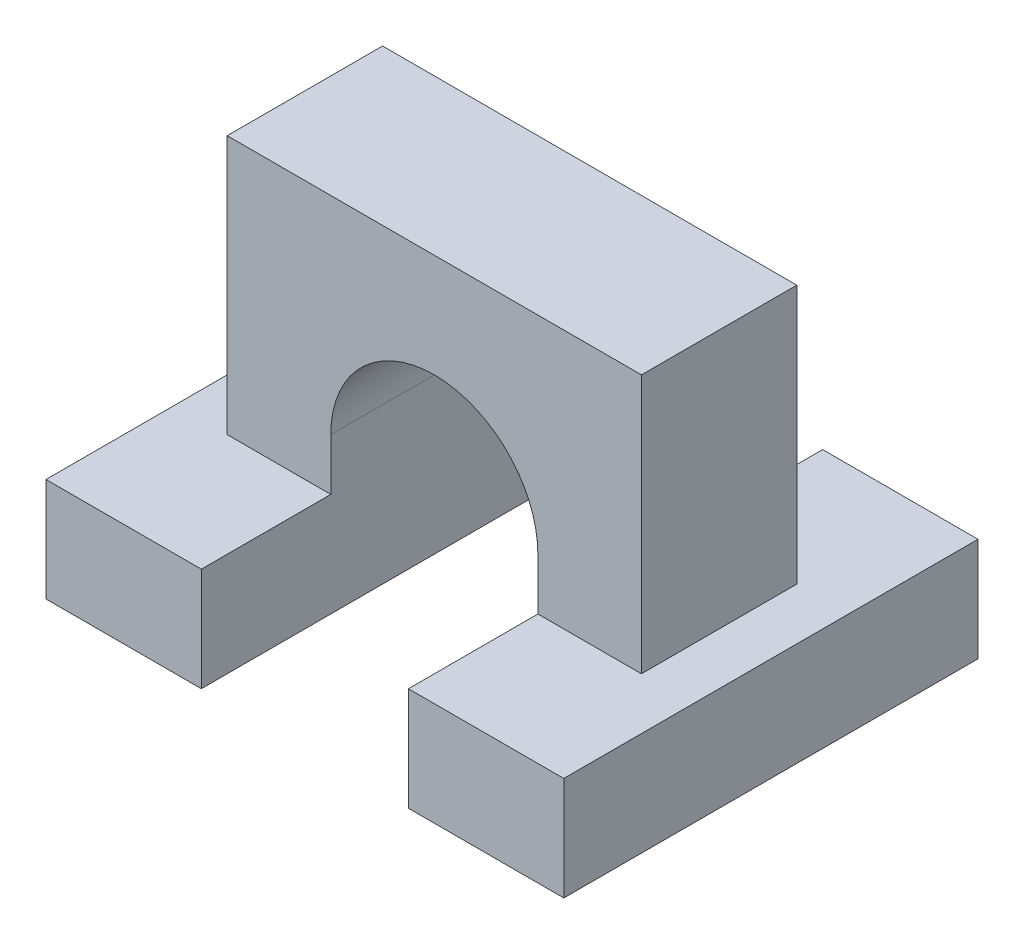
ISO-10303-21;
HEADER;
FILE_DESCRIPTION(('STEP AP214'),'2;1');
FILE_NAME('part.step','',(''),(''),'','','');
FILE_SCHEMA(('AUTOMOTIVE_DESIGN { 1 0 10303 214 1 1 1 1 }'));
ENDSEC;
DATA;
#1=APPLICATION_CONTEXT('core data for automotive mechanical design processes');
#2=APPLICATION_PROTOCOL_DEFINITION('international standard','automotive_design',2000,#1);
#3=PRODUCT_CONTEXT('',#1,'mechanical');
#4=PRODUCT('Part','Part','',(#3));
#5=PRODUCT_RELATED_PRODUCT_CATEGORY('part','',(#4));
#6=PRODUCT_DEFINITION_FORMATION('','',#4);
#7=PRODUCT_DEFINITION_CONTEXT('part definition',#1,'design');
#8=PRODUCT_DEFINITION('design','',#6,#7);
#9=PRODUCT_DEFINITION_SHAPE('','',#8);
#10=(LENGTH_UNIT() NAMED_UNIT(*) SI_UNIT(.MILLI.,.METRE.));
#11=(NAMED_UNIT(*) PLANE_ANGLE_UNIT() SI_UNIT($,.RADIAN.));
#12=(NAMED_UNIT(*) SI_UNIT($,.STERADIAN.) SOLID_ANGLE_UNIT());
#13=UNCERTAINTY_MEASURE_WITH_UNIT(LENGTH_MEASURE(1.E-05),#10,'distance_accuracy_value','');
#14=(GEOMETRIC_REPRESENTATION_CONTEXT(3) GLOBAL_UNCERTAINTY_ASSIGNED_CONTEXT((#13)) GLOBAL_UNIT_ASSIGNED_CONTEXT((#10,
#11,#12)) REPRESENTATION_CONTEXT('',''));
#15=CARTESIAN_POINT('',(0.,0.,0.));
#16=DIRECTION('',(0.,0.,1.));
#17=DIRECTION('',(1.,0.,0.));
#18=AXIS2_PLACEMENT_3D('',#15,#16,#17);
#19=CARTESIAN_POINT('',(0.,0.,15000.));
#20=DIRECTION('',(0.,0.,-1.));
#21=DIRECTION('',(-1.,0.,0.));
#22=AXIS2_PLACEMENT_3D('',#19,#20,#21);
#23=CYLINDRICAL_SURFACE('',#22,10000.);
#24=CARTESIAN_POINT('',(0.,0.,0.));
#25=DIRECTION('',(0.,0.,-1.));
#26=DIRECTION('',(1.,0.,0.));
#27=AXIS2_PLACEMENT_3D('',#24,#25,#26);
#28=CIRCLE('',#27,10000.);
#29=CARTESIAN_POINT('',(-10000.,0.,0.));
#30=VERTEX_POINT('',#29);
#31=CARTESIAN_POINT('',(10000.,0.,0.));
#32=VERTEX_POINT('',#31);
#33=EDGE_CURVE('E128',#30,#32,#28,.T.);
#34=ORIENTED_EDGE('',*,*,#33,.T.);
#35=DIRECTION('',(0.,0.,-1.));
#36=VECTOR('',#35,1.);
#37=CARTESIAN_POINT('',(10000.,0.,15000.));
#38=LINE('',#37,#36);
#39=CARTESIAN_POINT('',(10000.,0.,15000.));
#40=VERTEX_POINT('',#39);
#41=EDGE_CURVE('E11',#40,#32,#38,.T.);
#42=ORIENTED_EDGE('',*,*,#41,.F.);
#43=CARTESIAN_POINT('',(0.,0.,15000.));
#44=DIRECTION('',(0.,0.,-1.));
#45=DIRECTION('',(1.,0.,0.));
#46=AXIS2_PLACEMENT_3D('',#43,#44,#45);
#47=CIRCLE('',#46,10000.);
#48=CARTESIAN_POINT('',(-10000.,0.,15000.));
#49=VERTEX_POINT('',#48);
#50=EDGE_CURVE('E145',#49,#40,#47,.T.);
#51=ORIENTED_EDGE('',*,*,#50,.F.);
#52=DIRECTION('',(0.,0.,-1.));
#53=VECTOR('',#52,1.);
#54=CARTESIAN_POINT('',(-10000.,0.,15000.));
#55=LINE('',#54,#53);
#56=EDGE_CURVE('E117',#49,#30,#55,.T.);
#57=ORIENTED_EDGE('',*,*,#56,.T.);
#58=EDGE_LOOP('',(#34,#42,#51,#57));
#59=FACE_BOUND('',#58,.T.);
#60=ADVANCED_FACE('F33',(#59),#23,.F.);
#61=CARTESIAN_POINT('',(10000.,0.,15000.));
#62=DIRECTION('',(1.,0.,0.));
#63=DIRECTION('',(0.,1.,0.));
#64=AXIS2_PLACEMENT_3D('',#61,#62,#63);
#65=PLANE('',#64);
#66=DIRECTION('',(0.,-1.,0.));
#67=VECTOR('',#66,1.);
#68=CARTESIAN_POINT('',(10000.,0.,0.));
#69=LINE('',#68,#67);
#70=CARTESIAN_POINT('',(10000.,-5000.,0.));
#71=VERTEX_POINT('',#70);
#72=EDGE_CURVE('E131',#32,#71,#69,.T.);
#73=ORIENTED_EDGE('',*,*,#72,.T.);
#74=DIRECTION('',(0.,0.,-1.));
#75=VECTOR('',#74,1.);
#76=CARTESIAN_POINT('',(10000.,-5000.,-12500.));
#77=LINE('',#76,#75);
#78=CARTESIAN_POINT('',(10000.,-5000.,-12500.));
#79=VERTEX_POINT('',#78);
#80=EDGE_CURVE('E166',#71,#79,#77,.T.);
#81=ORIENTED_EDGE('',*,*,#80,.T.);
#82=DIRECTION('',(0.,1.,0.));
#83=VECTOR('',#82,1.);
#84=CARTESIAN_POINT('',(10000.,-15000.,-12500.));
#85=LINE('',#84,#83);
#86=CARTESIAN_POINT('',(10000.,-15000.,-12500.));
#87=VERTEX_POINT('',#86);
#88=EDGE_CURVE('E132',#87,#79,#85,.T.);
#89=ORIENTED_EDGE('',*,*,#88,.F.);
#90=DIRECTION('',(0.,0.,-1.));
#91=VECTOR('',#90,1.);
#92=CARTESIAN_POINT('',(10000.,-15000.,-12500.));
#93=LINE('',#92,#91);
#94=CARTESIAN_POINT('',(10000.,-15000.,27500.));
#95=VERTEX_POINT('',#94);
#96=EDGE_CURVE('E194',#95,#87,#93,.T.);
#97=ORIENTED_EDGE('',*,*,#96,.F.);
#98=DIRECTION('',(0.,1.,0.));
#99=VECTOR('',#98,1.);
#100=CARTESIAN_POINT('',(10000.,-15000.,27500.));
#101=LINE('',#100,#99);
#102=CARTESIAN_POINT('',(10000.,-5000.,27500.));
#103=VERTEX_POINT('',#102);
#104=EDGE_CURVE('E187',#95,#103,#101,.T.);
#105=ORIENTED_EDGE('',*,*,#104,.T.);
#106=CARTESIAN_POINT('',(10000.,-5000.,15000.));
#107=VERTEX_POINT('',#106);
#108=EDGE_CURVE('E201',#103,#107,#77,.T.);
#109=ORIENTED_EDGE('',*,*,#108,.T.);
#110=DIRECTION('',(0.,-1.,0.));
#111=VECTOR('',#110,1.);
#112=CARTESIAN_POINT('',(10000.,0.,15000.));
#113=LINE('',#112,#111);
#114=EDGE_CURVE('E88',#40,#107,#113,.T.);
#115=ORIENTED_EDGE('',*,*,#114,.F.);
#116=ORIENTED_EDGE('',*,*,#41,.T.);
#117=EDGE_LOOP('',(#73,#81,#89,#97,#105,#109,#115,#116));
#118=FACE_BOUND('',#117,.T.);
#119=ADVANCED_FACE('F302',(#118),#65,.F.);
#120=CARTESIAN_POINT('',(20000.,-5000.,15000.));
#121=DIRECTION('',(-1.,0.,0.));
#122=DIRECTION('',(0.,0.,1.));
#123=AXIS2_PLACEMENT_3D('',#120,#121,#122);
#124=PLANE('',#123);
#125=DIRECTION('',(0.,1.,0.));
#126=VECTOR('',#125,1.);
#127=CARTESIAN_POINT('',(20000.,-5000.,0.));
#128=LINE('',#127,#126);
#129=CARTESIAN_POINT('',(20000.,-5000.,0.));
#130=VERTEX_POINT('',#129);
#131=CARTESIAN_POINT('',(20000.,20000.,0.));
#132=VERTEX_POINT('',#131);
#133=EDGE_CURVE('E137',#130,#132,#128,.T.);
#134=ORIENTED_EDGE('',*,*,#133,.T.);
#135=DIRECTION('',(0.,0.,-1.));
#136=VECTOR('',#135,1.);
#137=CARTESIAN_POINT('',(20000.,20000.,15000.));
#138=LINE('',#137,#136);
#139=CARTESIAN_POINT('',(20000.,20000.,15000.));
#140=VERTEX_POINT('',#139);
#141=EDGE_CURVE('E148',#140,#132,#138,.T.);
#142=ORIENTED_EDGE('',*,*,#141,.F.);
#143=DIRECTION('',(0.,1.,0.));
#144=VECTOR('',#143,1.);
#145=CARTESIAN_POINT('',(20000.,-5000.,15000.));
#146=LINE('',#145,#144);
#147=CARTESIAN_POINT('',(20000.,-5000.,15000.));
#148=VERTEX_POINT('',#147);
#149=EDGE_CURVE('E157',#148,#140,#146,.T.);
#150=ORIENTED_EDGE('',*,*,#149,.F.);
#151=DIRECTION('',(0.,0.,-1.));
#152=VECTOR('',#151,1.);
#153=CARTESIAN_POINT('',(20000.,-5000.,15000.));
#154=LINE('',#153,#152);
#155=EDGE_CURVE('E41',#148,#130,#154,.T.);
#156=ORIENTED_EDGE('',*,*,#155,.T.);
#157=EDGE_LOOP('',(#134,#142,#150,#156));
#158=FACE_BOUND('',#157,.T.);
#159=ADVANCED_FACE('F154',(#158),#124,.F.);
#160=CARTESIAN_POINT('',(20000.,20000.,15000.));
#161=DIRECTION('',(0.,-1.,0.));
#162=DIRECTION('',(1.,0.,0.));
#163=AXIS2_PLACEMENT_3D('',#160,#161,#162);
#164=PLANE('',#163);
#165=DIRECTION('',(-1.,0.,0.));
#166=VECTOR('',#165,1.);
#167=CARTESIAN_POINT('',(20000.,20000.,0.));
#168=LINE('',#167,#166);
#169=CARTESIAN_POINT('',(-20000.,20000.,0.));
#170=VERTEX_POINT('',#169);
#171=EDGE_CURVE('E139',#132,#170,#168,.T.);
#172=ORIENTED_EDGE('',*,*,#171,.T.);
#173=DIRECTION('',(0.,0.,-1.));
#174=VECTOR('',#173,1.);
#175=CARTESIAN_POINT('',(-20000.,20000.,15000.));
#176=LINE('',#175,#174);
#177=CARTESIAN_POINT('',(-20000.,20000.,15000.));
#178=VERTEX_POINT('',#177);
#179=EDGE_CURVE('E116',#178,#170,#176,.T.);
#180=ORIENTED_EDGE('',*,*,#179,.F.);
#181=DIRECTION('',(-1.,0.,0.));
#182=VECTOR('',#181,1.);
#183=CARTESIAN_POINT('',(20000.,20000.,15000.));
#184=LINE('',#183,#182);
#185=EDGE_CURVE('E108',#140,#178,#184,.T.);
#186=ORIENTED_EDGE('',*,*,#185,.F.);
#187=ORIENTED_EDGE('',*,*,#141,.T.);
#188=EDGE_LOOP('',(#172,#180,#186,#187));
#189=FACE_BOUND('',#188,.T.);
#190=ADVANCED_FACE('F172',(#189),#164,.F.);
#191=CARTESIAN_POINT('',(-20000.,20000.,15000.));
#192=DIRECTION('',(1.,0.,0.));
#193=DIRECTION('',(0.,1.,0.));
#194=AXIS2_PLACEMENT_3D('',#191,#192,#193);
#195=PLANE('',#194);
#196=DIRECTION('',(0.,-1.,0.));
#197=VECTOR('',#196,1.);
#198=CARTESIAN_POINT('',(-20000.,20000.,0.));
#199=LINE('',#198,#197);
#200=CARTESIAN_POINT('',(-20000.,-5000.,0.));
#201=VERTEX_POINT('',#200);
#202=EDGE_CURVE('E73',#170,#201,#199,.T.);
#203=ORIENTED_EDGE('',*,*,#202,.T.);
#204=DIRECTION('',(0.,0.,-1.));
#205=VECTOR('',#204,1.);
#206=CARTESIAN_POINT('',(-20000.,-5000.,15000.));
#207=LINE('',#206,#205);
#208=CARTESIAN_POINT('',(-20000.,-5000.,15000.));
#209=VERTEX_POINT('',#208);
#210=EDGE_CURVE('E112',#209,#201,#207,.T.);
#211=ORIENTED_EDGE('',*,*,#210,.F.);
#212=DIRECTION('',(0.,-1.,0.));
#213=VECTOR('',#212,1.);
#214=CARTESIAN_POINT('',(-20000.,20000.,15000.));
#215=LINE('',#214,#213);
#216=EDGE_CURVE('E103',#178,#209,#215,.T.);
#217=ORIENTED_EDGE('',*,*,#216,.F.);
#218=ORIENTED_EDGE('',*,*,#179,.T.);
#219=EDGE_LOOP('',(#203,#211,#217,#218));
#220=FACE_BOUND('',#219,.T.);
#221=ADVANCED_FACE('F113',(#220),#195,.F.);
#222=CARTESIAN_POINT('',(-10000.,0.,15000.));
#223=DIRECTION('',(-1.,0.,0.));
#224=DIRECTION('',(0.,-1.,0.));
#225=AXIS2_PLACEMENT_3D('',#222,#223,#224);
#226=PLANE('',#225);
#227=DIRECTION('',(0.,1.,0.));
#228=VECTOR('',#227,1.);
#229=CARTESIAN_POINT('',(-10000.,0.,0.));
#230=LINE('',#229,#228);
#231=CARTESIAN_POINT('',(-9999.99999999999,-5000.,0.));
#232=VERTEX_POINT('',#231);
#233=EDGE_CURVE('E80',#232,#30,#230,.T.);
#234=ORIENTED_EDGE('',*,*,#233,.T.);
#235=ORIENTED_EDGE('',*,*,#56,.F.);
#236=DIRECTION('',(0.,1.,0.));
#237=VECTOR('',#236,1.);
#238=CARTESIAN_POINT('',(-10000.,0.,15000.));
#239=LINE('',#238,#237);
#240=CARTESIAN_POINT('',(-10000.,-5000.,15000.));
#241=VERTEX_POINT('',#240);
#242=EDGE_CURVE('E49',#241,#49,#239,.T.);
#243=ORIENTED_EDGE('',*,*,#242,.F.);
#244=DIRECTION('',(0.,0.,1.));
#245=VECTOR('',#244,1.);
#246=CARTESIAN_POINT('',(-10000.,-5000.,27500.));
#247=LINE('',#246,#245);
#248=CARTESIAN_POINT('',(-10000.,-5000.,27500.));
#249=VERTEX_POINT('',#248);
#250=EDGE_CURVE('E123',#241,#249,#247,.T.);
#251=ORIENTED_EDGE('',*,*,#250,.T.);
#252=DIRECTION('',(0.,1.,0.));
#253=VECTOR('',#252,1.);
#254=CARTESIAN_POINT('',(-10000.,-15000.,27500.));
#255=LINE('',#254,#253);
#256=CARTESIAN_POINT('',(-10000.,-15000.,27500.));
#257=VERTEX_POINT('',#256);
#258=EDGE_CURVE('E219',#257,#249,#255,.T.);
#259=ORIENTED_EDGE('',*,*,#258,.F.);
#260=DIRECTION('',(0.,0.,1.));
#261=VECTOR('',#260,1.);
#262=CARTESIAN_POINT('',(-10000.,-15000.,27500.));
#263=LINE('',#262,#261);
#264=CARTESIAN_POINT('',(-9999.99999999999,-15000.,-12500.));
#265=VERTEX_POINT('',#264);
#266=EDGE_CURVE('E240',#265,#257,#263,.T.);
#267=ORIENTED_EDGE('',*,*,#266,.F.);
#268=DIRECTION('',(0.,1.,0.));
#269=VECTOR('',#268,1.);
#270=CARTESIAN_POINT('',(-9999.99999999999,-15000.,-12500.));
#271=LINE('',#270,#269);
#272=CARTESIAN_POINT('',(-9999.99999999999,-5000.,-12500.));
#273=VERTEX_POINT('',#272);
#274=EDGE_CURVE('E216',#265,#273,#271,.T.);
#275=ORIENTED_EDGE('',*,*,#274,.T.);
#276=EDGE_CURVE('E230',#273,#232,#247,.T.);
#277=ORIENTED_EDGE('',*,*,#276,.T.);
#278=EDGE_LOOP('',(#234,#235,#243,#251,#259,#267,#275,#277));
#279=FACE_BOUND('',#278,.T.);
#280=ADVANCED_FACE('F336',(#279),#226,.F.);
#281=CARTESIAN_POINT('',(0.,0.,15000.));
#282=DIRECTION('',(0.,0.,1.));
#283=DIRECTION('',(1.,0.,0.));
#284=AXIS2_PLACEMENT_3D('',#281,#282,#283);
#285=PLANE('',#284);
#286=ORIENTED_EDGE('',*,*,#50,.T.);
#287=ORIENTED_EDGE('',*,*,#114,.T.);
#288=DIRECTION('',(1.,0.,0.));
#289=VECTOR('',#288,1.);
#290=CARTESIAN_POINT('',(10000.,-5000.,15000.));
#291=LINE('',#290,#289);
#292=EDGE_CURVE('E173',#107,#148,#291,.T.);
#293=ORIENTED_EDGE('',*,*,#292,.T.);
#294=ORIENTED_EDGE('',*,*,#149,.T.);
#295=ORIENTED_EDGE('',*,*,#185,.T.);
#296=ORIENTED_EDGE('',*,*,#216,.T.);
#297=DIRECTION('',(1.,0.,0.));
#298=VECTOR('',#297,1.);
#299=CARTESIAN_POINT('',(-20000.,-5000.,15000.));
#300=LINE('',#299,#298);
#301=EDGE_CURVE('E106',#209,#241,#300,.T.);
#302=ORIENTED_EDGE('',*,*,#301,.T.);
#303=ORIENTED_EDGE('',*,*,#242,.T.);
#304=EDGE_LOOP('',(#286,#287,#293,#294,#295,#296,#302,#303));
#305=FACE_BOUND('',#304,.T.);
#306=ADVANCED_FACE('F104',(#305),#285,.T.);
#307=CARTESIAN_POINT('',(0.,0.,0.));
#308=DIRECTION('',(0.,0.,1.));
#309=DIRECTION('',(1.,0.,0.));
#310=AXIS2_PLACEMENT_3D('',#307,#308,#309);
#311=PLANE('',#310);
#312=ORIENTED_EDGE('',*,*,#33,.F.);
#313=ORIENTED_EDGE('',*,*,#233,.F.);
#314=DIRECTION('',(1.,0.,0.));
#315=VECTOR('',#314,1.);
#316=CARTESIAN_POINT('',(-20000.,-5000.,0.));
#317=LINE('',#316,#315);
#318=EDGE_CURVE('E142',#201,#232,#317,.T.);
#319=ORIENTED_EDGE('',*,*,#318,.F.);
#320=ORIENTED_EDGE('',*,*,#202,.F.);
#321=ORIENTED_EDGE('',*,*,#171,.F.);
#322=ORIENTED_EDGE('',*,*,#133,.F.);
#323=DIRECTION('',(1.,0.,0.));
#324=VECTOR('',#323,1.);
#325=CARTESIAN_POINT('',(10000.,-5000.,0.));
#326=LINE('',#325,#324);
#327=EDGE_CURVE('E134',#71,#130,#326,.T.);
#328=ORIENTED_EDGE('',*,*,#327,.F.);
#329=ORIENTED_EDGE('',*,*,#72,.F.);
#330=EDGE_LOOP('',(#312,#313,#319,#320,#321,#322,#328,#329));
#331=FACE_BOUND('',#330,.T.);
#332=ADVANCED_FACE('F169',(#331),#311,.F.);
#333=CARTESIAN_POINT('',(25000.,-15000.,-12500.));
#334=DIRECTION('',(0.,0.,1.));
#335=DIRECTION('',(1.,0.,0.));
#336=AXIS2_PLACEMENT_3D('',#333,#334,#335);
#337=PLANE('',#336);
#338=DIRECTION('',(1.,0.,0.));
#339=VECTOR('',#338,1.);
#340=CARTESIAN_POINT('',(25000.,-5000.,-12500.));
#341=LINE('',#340,#339);
#342=CARTESIAN_POINT('',(25000.,-5000.,-12500.));
#343=VERTEX_POINT('',#342);
#344=EDGE_CURVE('E198',#79,#343,#341,.T.);
#345=ORIENTED_EDGE('',*,*,#344,.T.);
#346=DIRECTION('',(0.,1.,0.));
#347=VECTOR('',#346,1.);
#348=CARTESIAN_POINT('',(25000.,-15000.,-12500.));
#349=LINE('',#348,#347);
#350=CARTESIAN_POINT('',(25000.,-15000.,-12500.));
#351=VERTEX_POINT('',#350);
#352=EDGE_CURVE('E181',#351,#343,#349,.T.);
#353=ORIENTED_EDGE('',*,*,#352,.F.);
#354=DIRECTION('',(1.,0.,0.));
#355=VECTOR('',#354,1.);
#356=CARTESIAN_POINT('',(25000.,-15000.,-12500.));
#357=LINE('',#356,#355);
#358=EDGE_CURVE('E208',#87,#351,#357,.T.);
#359=ORIENTED_EDGE('',*,*,#358,.F.);
#360=ORIENTED_EDGE('',*,*,#88,.T.);
#361=EDGE_LOOP('',(#345,#353,#359,#360));
#362=FACE_BOUND('',#361,.T.);
#363=ADVANCED_FACE('F309',(#362),#337,.F.);
#364=CARTESIAN_POINT('',(25000.,-15000.,27500.));
#365=DIRECTION('',(-1.,0.,0.));
#366=DIRECTION('',(0.,-1.,0.));
#367=AXIS2_PLACEMENT_3D('',#364,#365,#366);
#368=PLANE('',#367);
#369=DIRECTION('',(0.,0.,1.));
#370=VECTOR('',#369,1.);
#371=CARTESIAN_POINT('',(25000.,-5000.,27500.));
#372=LINE('',#371,#370);
#373=CARTESIAN_POINT('',(25000.,-5000.,27500.));
#374=VERTEX_POINT('',#373);
#375=EDGE_CURVE('E195',#343,#374,#372,.T.);
#376=ORIENTED_EDGE('',*,*,#375,.T.);
#377=DIRECTION('',(0.,1.,0.));
#378=VECTOR('',#377,1.);
#379=CARTESIAN_POINT('',(25000.,-15000.,27500.));
#380=LINE('',#379,#378);
#381=CARTESIAN_POINT('',(25000.,-15000.,27500.));
#382=VERTEX_POINT('',#381);
#383=EDGE_CURVE('E184',#382,#374,#380,.T.);
#384=ORIENTED_EDGE('',*,*,#383,.F.);
#385=DIRECTION('',(0.,0.,1.));
#386=VECTOR('',#385,1.);
#387=CARTESIAN_POINT('',(25000.,-15000.,27500.));
#388=LINE('',#387,#386);
#389=EDGE_CURVE('E205',#351,#382,#388,.T.);
#390=ORIENTED_EDGE('',*,*,#389,.F.);
#391=ORIENTED_EDGE('',*,*,#352,.T.);
#392=EDGE_LOOP('',(#376,#384,#390,#391));
#393=FACE_BOUND('',#392,.T.);
#394=ADVANCED_FACE('F314',(#393),#368,.F.);
#395=CARTESIAN_POINT('',(10000.,-15000.,27500.));
#396=DIRECTION('',(0.,0.,-1.));
#397=DIRECTION('',(-1.,0.,0.));
#398=AXIS2_PLACEMENT_3D('',#395,#396,#397);
#399=PLANE('',#398);
#400=DIRECTION('',(-1.,0.,0.));
#401=VECTOR('',#400,1.);
#402=CARTESIAN_POINT('',(10000.,-5000.,27500.));
#403=LINE('',#402,#401);
#404=EDGE_CURVE('E191',#374,#103,#403,.T.);
#405=ORIENTED_EDGE('',*,*,#404,.T.);
#406=ORIENTED_EDGE('',*,*,#104,.F.);
#407=DIRECTION('',(-1.,0.,0.));
#408=VECTOR('',#407,1.);
#409=CARTESIAN_POINT('',(10000.,-15000.,27500.));
#410=LINE('',#409,#408);
#411=EDGE_CURVE('E190',#382,#95,#410,.T.);
#412=ORIENTED_EDGE('',*,*,#411,.F.);
#413=ORIENTED_EDGE('',*,*,#383,.T.);
#414=EDGE_LOOP('',(#405,#406,#412,#413));
#415=FACE_BOUND('',#414,.T.);
#416=ADVANCED_FACE('F296',(#415),#399,.F.);
#417=CARTESIAN_POINT('',(-2.66453525910038E-12,-15000.,0.));
#418=DIRECTION('',(0.,1.,0.));
#419=DIRECTION('',(-1.,0.,0.));
#420=AXIS2_PLACEMENT_3D('',#417,#418,#419);
#421=PLANE('',#420);
#422=ORIENTED_EDGE('',*,*,#96,.T.);
#423=ORIENTED_EDGE('',*,*,#358,.T.);
#424=ORIENTED_EDGE('',*,*,#389,.T.);
#425=ORIENTED_EDGE('',*,*,#411,.T.);
#426=EDGE_LOOP('',(#422,#423,#424,#425));
#427=FACE_BOUND('',#426,.T.);
#428=ADVANCED_FACE('F312',(#427),#421,.F.);
#429=CARTESIAN_POINT('',(-8.88178419700125E-13,-5000.,0.));
#430=DIRECTION('',(0.,1.,0.));
#431=DIRECTION('',(-1.,0.,0.));
#432=AXIS2_PLACEMENT_3D('',#429,#430,#431);
#433=PLANE('',#432);
#434=ORIENTED_EDGE('',*,*,#155,.F.);
#435=ORIENTED_EDGE('',*,*,#292,.F.);
#436=ORIENTED_EDGE('',*,*,#108,.F.);
#437=ORIENTED_EDGE('',*,*,#404,.F.);
#438=ORIENTED_EDGE('',*,*,#375,.F.);
#439=ORIENTED_EDGE('',*,*,#344,.F.);
#440=ORIENTED_EDGE('',*,*,#80,.F.);
#441=ORIENTED_EDGE('',*,*,#327,.T.);
#442=EDGE_LOOP('',(#434,#435,#436,#437,#438,#439,#440,#441));
#443=FACE_BOUND('',#442,.T.);
#444=ADVANCED_FACE('F163',(#443),#433,.T.);
#445=CARTESIAN_POINT('',(-25000.,-15000.,-12500.));
#446=DIRECTION('',(1.,0.,0.));
#447=DIRECTION('',(0.,1.,0.));
#448=AXIS2_PLACEMENT_3D('',#445,#446,#447);
#449=PLANE('',#448);
#450=DIRECTION('',(0.,0.,-1.));
#451=VECTOR('',#450,1.);
#452=CARTESIAN_POINT('',(-25000.,-4999.99999999999,-12500.));
#453=LINE('',#452,#451);
#454=CARTESIAN_POINT('',(-25000.,-4999.99999999999,27500.));
#455=VERTEX_POINT('',#454);
#456=CARTESIAN_POINT('',(-25000.,-4999.99999999999,-12500.));
#457=VERTEX_POINT('',#456);
#458=EDGE_CURVE('E235',#455,#457,#453,.T.);
#459=ORIENTED_EDGE('',*,*,#458,.T.);
#460=DIRECTION('',(0.,1.,0.));
#461=VECTOR('',#460,1.);
#462=CARTESIAN_POINT('',(-25000.,-15000.,-12500.));
#463=LINE('',#462,#461);
#464=CARTESIAN_POINT('',(-25000.,-15000.,-12500.));
#465=VERTEX_POINT('',#464);
#466=EDGE_CURVE('E213',#465,#457,#463,.T.);
#467=ORIENTED_EDGE('',*,*,#466,.F.);
#468=DIRECTION('',(0.,0.,-1.));
#469=VECTOR('',#468,1.);
#470=CARTESIAN_POINT('',(-25000.,-15000.,-12500.));
#471=LINE('',#470,#469);
#472=CARTESIAN_POINT('',(-25000.,-15000.,27500.));
#473=VERTEX_POINT('',#472);
#474=EDGE_CURVE('E229',#473,#465,#471,.T.);
#475=ORIENTED_EDGE('',*,*,#474,.F.);
#476=DIRECTION('',(0.,1.,0.));
#477=VECTOR('',#476,1.);
#478=CARTESIAN_POINT('',(-25000.,-15000.,27500.));
#479=LINE('',#478,#477);
#480=EDGE_CURVE('E222',#473,#455,#479,.T.);
#481=ORIENTED_EDGE('',*,*,#480,.T.);
#482=EDGE_LOOP('',(#459,#467,#475,#481));
#483=FACE_BOUND('',#482,.T.);
#484=ADVANCED_FACE('F261',(#483),#449,.F.);
#485=CARTESIAN_POINT('',(-9999.99999999999,-15000.,-12500.));
#486=DIRECTION('',(0.,0.,1.));
#487=DIRECTION('',(1.,0.,0.));
#488=AXIS2_PLACEMENT_3D('',#485,#486,#487);
#489=PLANE('',#488);
#490=DIRECTION('',(1.,0.,0.));
#491=VECTOR('',#490,1.);
#492=CARTESIAN_POINT('',(-9999.99999999999,-5000.,-12500.));
#493=LINE('',#492,#491);
#494=EDGE_CURVE('E232',#457,#273,#493,.T.);
#495=ORIENTED_EDGE('',*,*,#494,.T.);
#496=ORIENTED_EDGE('',*,*,#274,.F.);
#497=DIRECTION('',(1.,0.,0.));
#498=VECTOR('',#497,1.);
#499=CARTESIAN_POINT('',(-9999.99999999999,-15000.,-12500.));
#500=LINE('',#499,#498);
#501=EDGE_CURVE('E243',#465,#265,#500,.T.);
#502=ORIENTED_EDGE('',*,*,#501,.F.);
#503=ORIENTED_EDGE('',*,*,#466,.T.);
#504=EDGE_LOOP('',(#495,#496,#502,#503));
#505=FACE_BOUND('',#504,.T.);
#506=ADVANCED_FACE('F265',(#505),#489,.F.);
#507=CARTESIAN_POINT('',(-25000.,-15000.,27500.));
#508=DIRECTION('',(0.,0.,-1.));
#509=DIRECTION('',(-1.,0.,0.));
#510=AXIS2_PLACEMENT_3D('',#507,#508,#509);
#511=PLANE('',#510);
#512=DIRECTION('',(-1.,0.,0.));
#513=VECTOR('',#512,1.);
#514=CARTESIAN_POINT('',(-25000.,-4999.99999999999,27500.));
#515=LINE('',#514,#513);
#516=EDGE_CURVE('E226',#249,#455,#515,.T.);
#517=ORIENTED_EDGE('',*,*,#516,.T.);
#518=ORIENTED_EDGE('',*,*,#480,.F.);
#519=DIRECTION('',(-1.,0.,0.));
#520=VECTOR('',#519,1.);
#521=CARTESIAN_POINT('',(-25000.,-15000.,27500.));
#522=LINE('',#521,#520);
#523=EDGE_CURVE('E225',#257,#473,#522,.T.);
#524=ORIENTED_EDGE('',*,*,#523,.F.);
#525=ORIENTED_EDGE('',*,*,#258,.T.);
#526=EDGE_LOOP('',(#517,#518,#524,#525));
#527=FACE_BOUND('',#526,.T.);
#528=ADVANCED_FACE('F398',(#527),#511,.F.);
#529=CARTESIAN_POINT('',(-2.66453525910038E-12,-15000.,0.));
#530=DIRECTION('',(0.,1.,0.));
#531=DIRECTION('',(-1.,0.,0.));
#532=AXIS2_PLACEMENT_3D('',#529,#530,#531);
#533=PLANE('',#532);
#534=ORIENTED_EDGE('',*,*,#474,.T.);
#535=ORIENTED_EDGE('',*,*,#501,.T.);
#536=ORIENTED_EDGE('',*,*,#266,.T.);
#537=ORIENTED_EDGE('',*,*,#523,.T.);
#538=EDGE_LOOP('',(#534,#535,#536,#537));
#539=FACE_BOUND('',#538,.T.);
#540=ADVANCED_FACE('F251',(#539),#533,.F.);
#541=CARTESIAN_POINT('',(-8.88178419700125E-13,-5000.,0.));
#542=DIRECTION('',(0.,1.,0.));
#543=DIRECTION('',(-1.,0.,0.));
#544=AXIS2_PLACEMENT_3D('',#541,#542,#543);
#545=PLANE('',#544);
#546=ORIENTED_EDGE('',*,*,#250,.F.);
#547=ORIENTED_EDGE('',*,*,#301,.F.);
#548=ORIENTED_EDGE('',*,*,#210,.T.);
#549=ORIENTED_EDGE('',*,*,#318,.T.);
#550=ORIENTED_EDGE('',*,*,#276,.F.);
#551=ORIENTED_EDGE('',*,*,#494,.F.);
#552=ORIENTED_EDGE('',*,*,#458,.F.);
#553=ORIENTED_EDGE('',*,*,#516,.F.);
#554=EDGE_LOOP('',(#546,#547,#548,#549,#550,#551,#552,#553));
#555=FACE_BOUND('',#554,.T.);
#556=ADVANCED_FACE('F120',(#555),#545,.T.);
#557=CLOSED_SHELL('',(#60,#119,#159,#190,#221,#280,#306,#332,#363,#394,#416,#428,#444,#484,#506,
#528,#540,#556));
#558=MANIFOLD_SOLID_BREP('B2',#557);
#559=ADVANCED_BREP_SHAPE_REPRESENTATION('',(#18,#558),#14);
#560=SHAPE_DEFINITION_REPRESENTATION(#9,#559);
ENDSEC;
END-ISO-10303-21;
